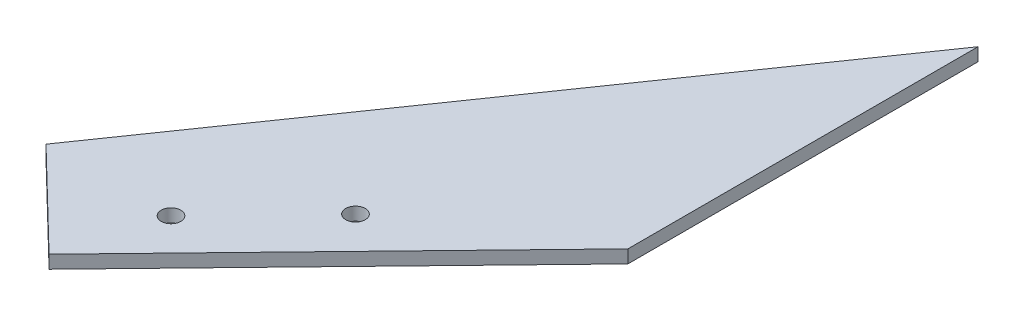
ISO-10303-21;
HEADER;
FILE_DESCRIPTION(('STEP AP214'),'2;1');
FILE_NAME('part.step','',(''),(''),'','','');
FILE_SCHEMA(('AUTOMOTIVE_DESIGN { 1 0 10303 214 1 1 1 1 }'));
ENDSEC;
DATA;
#1=APPLICATION_CONTEXT('core data for automotive mechanical design processes');
#2=APPLICATION_PROTOCOL_DEFINITION('international standard','automotive_design',2000,#1);
#3=PRODUCT_CONTEXT('',#1,'mechanical');
#4=PRODUCT('Part','Part','',(#3));
#5=PRODUCT_RELATED_PRODUCT_CATEGORY('part','',(#4));
#6=PRODUCT_DEFINITION_FORMATION('','',#4);
#7=PRODUCT_DEFINITION_CONTEXT('part definition',#1,'design');
#8=PRODUCT_DEFINITION('design','',#6,#7);
#9=PRODUCT_DEFINITION_SHAPE('','',#8);
#10=(LENGTH_UNIT() NAMED_UNIT(*) SI_UNIT(.MILLI.,.METRE.));
#11=(NAMED_UNIT(*) PLANE_ANGLE_UNIT() SI_UNIT($,.RADIAN.));
#12=(NAMED_UNIT(*) SI_UNIT($,.STERADIAN.) SOLID_ANGLE_UNIT());
#13=UNCERTAINTY_MEASURE_WITH_UNIT(LENGTH_MEASURE(1.E-05),#10,'distance_accuracy_value','');
#14=(GEOMETRIC_REPRESENTATION_CONTEXT(3) GLOBAL_UNCERTAINTY_ASSIGNED_CONTEXT((#13)) GLOBAL_UNIT_ASSIGNED_CONTEXT((#10,
#11,#12)) REPRESENTATION_CONTEXT('',''));
#15=CARTESIAN_POINT('',(0.,0.,0.));
#16=DIRECTION('',(0.,0.,1.));
#17=DIRECTION('',(1.,0.,0.));
#18=AXIS2_PLACEMENT_3D('',#15,#16,#17);
#19=CARTESIAN_POINT('',(-126.4854181126,2024.9,1968.975524279));
#20=DIRECTION('',(0.,-1.,0.));
#21=DIRECTION('',(-0.69565718102514,0.,0.718373918296145));
#22=AXIS2_PLACEMENT_3D('',#19,#20,#21);
#23=CYLINDRICAL_SURFACE('',#22,4.5);
#24=CARTESIAN_POINT('',(-126.4854181126,2025.,1968.975524279));
#25=DIRECTION('',(0.,-1.,0.));
#26=DIRECTION('',(-0.69565718102514,0.,0.718373918296145));
#27=AXIS2_PLACEMENT_3D('',#24,#25,#26);
#28=CIRCLE('',#27,4.5);
#29=CARTESIAN_POINT('',(-129.6158754272,2025.,1972.208206911));
#30=VERTEX_POINT('',#29);
#31=EDGE_CURVE('E127',#30,#30,#28,.T.);
#32=ORIENTED_EDGE('',*,*,#31,.T.);
#33=DIRECTION('',(0.,1.,0.));
#34=VECTOR('',#33,1.);
#35=CARTESIAN_POINT('',(-129.6158754272,2024.9,1972.208206911));
#36=LINE('',#35,#34);
#37=CARTESIAN_POINT('',(-129.6158754272,2031.,1972.208206911));
#38=VERTEX_POINT('',#37);
#39=EDGE_CURVE('E11',#30,#38,#36,.T.);
#40=ORIENTED_EDGE('',*,*,#39,.T.);
#41=CARTESIAN_POINT('',(-126.4854181126,2031.,1968.975524279));
#42=DIRECTION('',(0.,-1.,0.));
#43=DIRECTION('',(-0.69565718102514,0.,0.718373918296145));
#44=AXIS2_PLACEMENT_3D('',#41,#42,#43);
#45=CIRCLE('',#44,4.5);
#46=EDGE_CURVE('E134',#38,#38,#45,.T.);
#47=ORIENTED_EDGE('',*,*,#46,.F.);
#48=ORIENTED_EDGE('',*,*,#39,.F.);
#49=EDGE_LOOP('',(#32,#40,#47,#48));
#50=FACE_BOUND('',#49,.T.);
#51=ADVANCED_FACE('F17',(#50),#23,.F.);
#52=CARTESIAN_POINT('',(-168.2248489741,2024.9,2012.077959377));
#53=DIRECTION('',(0.,-1.,0.));
#54=DIRECTION('',(-0.69565718102514,0.,0.718373918296145));
#55=AXIS2_PLACEMENT_3D('',#52,#53,#54);
#56=CYLINDRICAL_SURFACE('',#55,4.5);
#57=CARTESIAN_POINT('',(-168.2248489741,2025.,2012.077959377));
#58=DIRECTION('',(0.,-1.,0.));
#59=DIRECTION('',(-0.69565718102514,0.,0.718373918296145));
#60=AXIS2_PLACEMENT_3D('',#57,#58,#59);
#61=CIRCLE('',#60,4.5);
#62=CARTESIAN_POINT('',(-171.3553062887,2025.,2015.310642009));
#63=VERTEX_POINT('',#62);
#64=EDGE_CURVE('E131',#63,#63,#61,.T.);
#65=ORIENTED_EDGE('',*,*,#64,.T.);
#66=DIRECTION('',(0.,1.,0.));
#67=VECTOR('',#66,1.);
#68=CARTESIAN_POINT('',(-171.3553062887,2024.9,2015.310642009));
#69=LINE('',#68,#67);
#70=CARTESIAN_POINT('',(-171.3553062887,2031.,2015.310642009));
#71=VERTEX_POINT('',#70);
#72=EDGE_CURVE('E26',#63,#71,#69,.T.);
#73=ORIENTED_EDGE('',*,*,#72,.T.);
#74=CARTESIAN_POINT('',(-168.2248489741,2031.,2012.077959377));
#75=DIRECTION('',(0.,-1.,0.));
#76=DIRECTION('',(-0.69565718102514,0.,0.718373918296145));
#77=AXIS2_PLACEMENT_3D('',#74,#75,#76);
#78=CIRCLE('',#77,4.5);
#79=EDGE_CURVE('E145',#71,#71,#78,.T.);
#80=ORIENTED_EDGE('',*,*,#79,.F.);
#81=ORIENTED_EDGE('',*,*,#72,.F.);
#82=EDGE_LOOP('',(#65,#73,#80,#81));
#83=FACE_BOUND('',#82,.T.);
#84=ADVANCED_FACE('F19',(#83),#56,.F.);
#85=CARTESIAN_POINT('',(-225.5044668652,2025.,2012.290971686));
#86=DIRECTION('',(-0.821774993712932,0.,-0.569812126676953));
#87=DIRECTION('',(-0.569812126676953,0.,0.821774993712932));
#88=AXIS2_PLACEMENT_3D('',#85,#86,#87);
#89=PLANE('',#88);
#90=DIRECTION('',(0.,1.,0.));
#91=VECTOR('',#90,1.);
#92=CARTESIAN_POINT('',(-225.5044668652,2025.,2012.290971686));
#93=LINE('',#92,#91);
#94=CARTESIAN_POINT('',(-225.5044668652,2025.,2012.290971686));
#95=VERTEX_POINT('',#94);
#96=CARTESIAN_POINT('',(-225.5044668652,2031.,2012.290971686));
#97=VERTEX_POINT('',#96);
#98=EDGE_CURVE('E137',#95,#97,#93,.T.);
#99=ORIENTED_EDGE('',*,*,#98,.T.);
#100=DIRECTION('',(0.569812126676953,0.,-0.821774993712932));
#101=VECTOR('',#100,1.);
#102=CARTESIAN_POINT('',(-225.5044668652,2031.,2012.290971686));
#103=LINE('',#102,#101);
#104=CARTESIAN_POINT('',(-50.,2031.,1759.180910663));
#105=VERTEX_POINT('',#104);
#106=EDGE_CURVE('E130',#97,#105,#103,.T.);
#107=ORIENTED_EDGE('',*,*,#106,.T.);
#108=DIRECTION('',(0.,1.,0.));
#109=VECTOR('',#108,1.);
#110=CARTESIAN_POINT('',(-50.,2025.,1759.180910663));
#111=LINE('',#110,#109);
#112=CARTESIAN_POINT('',(-50.,2025.,1759.180910663));
#113=VERTEX_POINT('',#112);
#114=EDGE_CURVE('E111',#113,#105,#111,.T.);
#115=ORIENTED_EDGE('',*,*,#114,.F.);
#116=DIRECTION('',(0.569812126676953,0.,-0.821774993712932));
#117=VECTOR('',#116,1.);
#118=CARTESIAN_POINT('',(-225.5044668652,2025.,2012.290971686));
#119=LINE('',#118,#117);
#120=EDGE_CURVE('E94',#95,#113,#119,.T.);
#121=ORIENTED_EDGE('',*,*,#120,.F.);
#122=EDGE_LOOP('',(#99,#107,#115,#121));
#123=FACE_BOUND('',#122,.T.);
#124=ADVANCED_FACE('F169',(#123),#89,.T.);
#125=CARTESIAN_POINT('',(-117.9256029367,2031.,1914.909380519));
#126=DIRECTION('',(0.,-1.,0.));
#127=DIRECTION('',(0.,0.,-1.));
#128=AXIS2_PLACEMENT_3D('',#125,#126,#127);
#129=PLANE('',#128);
#130=ORIENTED_EDGE('',*,*,#46,.T.);
#131=EDGE_LOOP('',(#130));
#132=FACE_BOUND('',#131,.T.);
#133=ORIENTED_EDGE('',*,*,#79,.T.);
#134=EDGE_LOOP('',(#133));
#135=FACE_BOUND('',#134,.T.);
#136=DIRECTION('',(0.,0.,1.));
#137=VECTOR('',#136,1.);
#138=CARTESIAN_POINT('',(-50.,2031.,1759.180910663));
#139=LINE('',#138,#137);
#140=CARTESIAN_POINT('',(-50.,2031.,1920.179751838));
#141=VERTEX_POINT('',#140);
#142=EDGE_CURVE('E101',#105,#141,#139,.T.);
#143=ORIENTED_EDGE('',*,*,#142,.F.);
#144=ORIENTED_EDGE('',*,*,#106,.F.);
#145=DIRECTION('',(-0.718373918296145,0.,-0.69565718102514));
#146=VECTOR('',#145,1.);
#147=CARTESIAN_POINT('',(-180.9652839309,2031.,2055.42171691));
#148=LINE('',#147,#146);
#149=CARTESIAN_POINT('',(-180.9652839309,2031.,2055.42171691));
#150=VERTEX_POINT('',#149);
#151=EDGE_CURVE('E100',#150,#97,#148,.T.);
#152=ORIENTED_EDGE('',*,*,#151,.F.);
#153=DIRECTION('',(-0.69565718102514,0.,0.718373918296145));
#154=VECTOR('',#153,1.);
#155=CARTESIAN_POINT('',(-50.,2031.,1920.179751838));
#156=LINE('',#155,#154);
#157=EDGE_CURVE('E117',#141,#150,#156,.T.);
#158=ORIENTED_EDGE('',*,*,#157,.F.);
#159=EDGE_LOOP('',(#143,#144,#152,#158));
#160=FACE_BOUND('',#159,.T.);
#161=ADVANCED_FACE('F158',(#132,#135,#160),#129,.F.);
#162=CARTESIAN_POINT('',(-117.9256029367,2025.,1914.909380519));
#163=DIRECTION('',(0.,-1.,0.));
#164=DIRECTION('',(0.,0.,-1.));
#165=AXIS2_PLACEMENT_3D('',#162,#163,#164);
#166=PLANE('',#165);
#167=ORIENTED_EDGE('',*,*,#31,.F.);
#168=EDGE_LOOP('',(#167));
#169=FACE_BOUND('',#168,.T.);
#170=ORIENTED_EDGE('',*,*,#64,.F.);
#171=EDGE_LOOP('',(#170));
#172=FACE_BOUND('',#171,.T.);
#173=DIRECTION('',(-0.69565718102514,0.,0.718373918296145));
#174=VECTOR('',#173,1.);
#175=CARTESIAN_POINT('',(-50.,2025.,1920.179751838));
#176=LINE('',#175,#174);
#177=CARTESIAN_POINT('',(-50.,2025.,1920.179751838));
#178=VERTEX_POINT('',#177);
#179=CARTESIAN_POINT('',(-180.9652839309,2025.,2055.42171691));
#180=VERTEX_POINT('',#179);
#181=EDGE_CURVE('E92',#178,#180,#176,.T.);
#182=ORIENTED_EDGE('',*,*,#181,.T.);
#183=DIRECTION('',(-0.718373918296145,0.,-0.69565718102514));
#184=VECTOR('',#183,1.);
#185=CARTESIAN_POINT('',(-180.9652839309,2025.,2055.42171691));
#186=LINE('',#185,#184);
#187=EDGE_CURVE('E141',#180,#95,#186,.T.);
#188=ORIENTED_EDGE('',*,*,#187,.T.);
#189=ORIENTED_EDGE('',*,*,#120,.T.);
#190=DIRECTION('',(0.,0.,1.));
#191=VECTOR('',#190,1.);
#192=CARTESIAN_POINT('',(-50.,2025.,1759.180910663));
#193=LINE('',#192,#191);
#194=EDGE_CURVE('E88',#113,#178,#193,.T.);
#195=ORIENTED_EDGE('',*,*,#194,.T.);
#196=EDGE_LOOP('',(#182,#188,#189,#195));
#197=FACE_BOUND('',#196,.T.);
#198=ADVANCED_FACE('F90',(#169,#172,#197),#166,.T.);
#199=CARTESIAN_POINT('',(-180.9652839309,2025.,2055.42171691));
#200=DIRECTION('',(-0.69565718102514,0.,0.718373918296145));
#201=DIRECTION('',(0.,1.,0.));
#202=AXIS2_PLACEMENT_3D('',#199,#200,#201);
#203=PLANE('',#202);
#204=DIRECTION('',(0.,1.,0.));
#205=VECTOR('',#204,1.);
#206=CARTESIAN_POINT('',(-180.9652839309,2025.,2055.42171691));
#207=LINE('',#206,#205);
#208=EDGE_CURVE('E109',#180,#150,#207,.T.);
#209=ORIENTED_EDGE('',*,*,#208,.T.);
#210=ORIENTED_EDGE('',*,*,#151,.T.);
#211=ORIENTED_EDGE('',*,*,#98,.F.);
#212=ORIENTED_EDGE('',*,*,#187,.F.);
#213=EDGE_LOOP('',(#209,#210,#211,#212));
#214=FACE_BOUND('',#213,.T.);
#215=ADVANCED_FACE('F164',(#214),#203,.T.);
#216=CARTESIAN_POINT('',(-50.,2025.,1759.180910663));
#217=DIRECTION('',(1.,0.,0.));
#218=DIRECTION('',(0.,0.,-1.));
#219=AXIS2_PLACEMENT_3D('',#216,#217,#218);
#220=PLANE('',#219);
#221=ORIENTED_EDGE('',*,*,#114,.T.);
#222=ORIENTED_EDGE('',*,*,#142,.T.);
#223=DIRECTION('',(0.,1.,0.));
#224=VECTOR('',#223,1.);
#225=CARTESIAN_POINT('',(-50.,2025.,1920.179751838));
#226=LINE('',#225,#224);
#227=EDGE_CURVE('E107',#178,#141,#226,.T.);
#228=ORIENTED_EDGE('',*,*,#227,.F.);
#229=ORIENTED_EDGE('',*,*,#194,.F.);
#230=EDGE_LOOP('',(#221,#222,#228,#229));
#231=FACE_BOUND('',#230,.T.);
#232=ADVANCED_FACE('F113',(#231),#220,.T.);
#233=CARTESIAN_POINT('',(-50.,2025.,1920.179751838));
#234=DIRECTION('',(0.718373918296145,0.,0.69565718102514));
#235=DIRECTION('',(0.,-1.,0.));
#236=AXIS2_PLACEMENT_3D('',#233,#234,#235);
#237=PLANE('',#236);
#238=ORIENTED_EDGE('',*,*,#227,.T.);
#239=ORIENTED_EDGE('',*,*,#157,.T.);
#240=ORIENTED_EDGE('',*,*,#208,.F.);
#241=ORIENTED_EDGE('',*,*,#181,.F.);
#242=EDGE_LOOP('',(#238,#239,#240,#241));
#243=FACE_BOUND('',#242,.T.);
#244=ADVANCED_FACE('F105',(#243),#237,.T.);
#245=CLOSED_SHELL('',(#51,#84,#124,#161,#198,#215,#232,#244));
#246=MANIFOLD_SOLID_BREP('B1',#245);
#247=ADVANCED_BREP_SHAPE_REPRESENTATION('',(#18,#246),#14);
#248=SHAPE_DEFINITION_REPRESENTATION(#9,#247);
ENDSEC;
END-ISO-10303-21;
